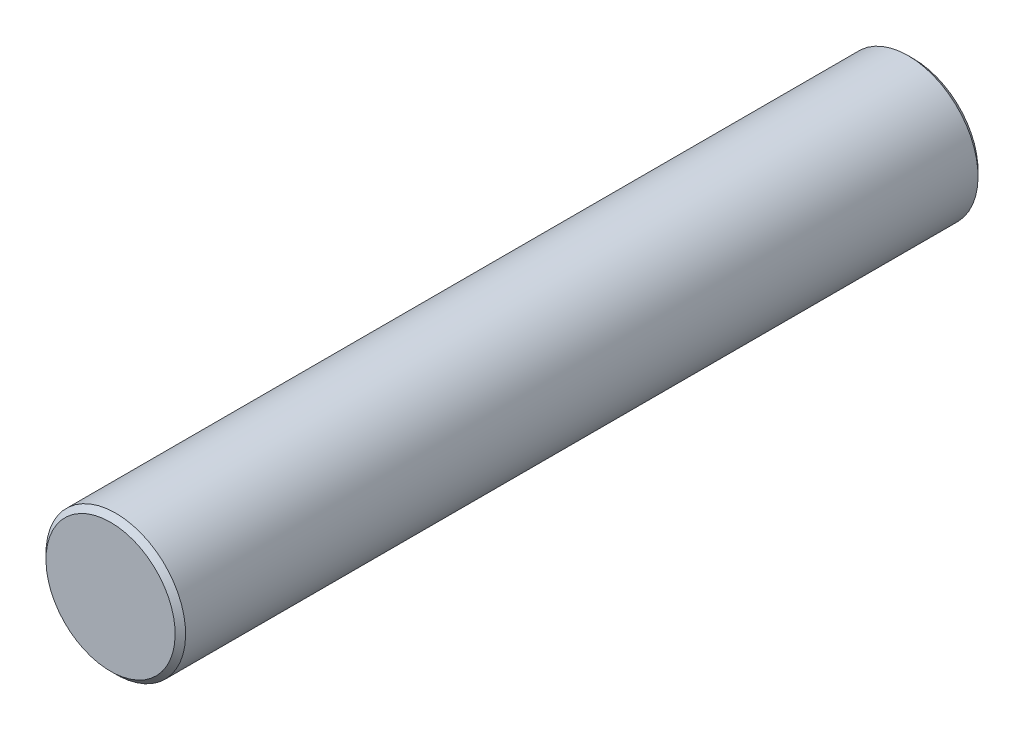
ISO-10303-21;
HEADER;
FILE_DESCRIPTION(('STEP AP214'),'2;1');
FILE_NAME('part.step','',(''),(''),'','','');
FILE_SCHEMA(('AUTOMOTIVE_DESIGN { 1 0 10303 214 1 1 1 1 }'));
ENDSEC;
DATA;
#1=APPLICATION_CONTEXT('core data for automotive mechanical design processes');
#2=APPLICATION_PROTOCOL_DEFINITION('international standard','automotive_design',2000,#1);
#3=PRODUCT_CONTEXT('',#1,'mechanical');
#4=PRODUCT('Part','Part','',(#3));
#5=PRODUCT_RELATED_PRODUCT_CATEGORY('part','',(#4));
#6=PRODUCT_DEFINITION_FORMATION('','',#4);
#7=PRODUCT_DEFINITION_CONTEXT('part definition',#1,'design');
#8=PRODUCT_DEFINITION('design','',#6,#7);
#9=PRODUCT_DEFINITION_SHAPE('','',#8);
#10=(LENGTH_UNIT() NAMED_UNIT(*) SI_UNIT(.MILLI.,.METRE.));
#11=(NAMED_UNIT(*) PLANE_ANGLE_UNIT() SI_UNIT($,.RADIAN.));
#12=(NAMED_UNIT(*) SI_UNIT($,.STERADIAN.) SOLID_ANGLE_UNIT());
#13=UNCERTAINTY_MEASURE_WITH_UNIT(LENGTH_MEASURE(1.E-05),#10,'distance_accuracy_value','');
#14=(GEOMETRIC_REPRESENTATION_CONTEXT(3) GLOBAL_UNCERTAINTY_ASSIGNED_CONTEXT((#13)) GLOBAL_UNIT_ASSIGNED_CONTEXT((#10,
#11,#12)) REPRESENTATION_CONTEXT('',''));
#15=CARTESIAN_POINT('',(0.,0.,0.));
#16=DIRECTION('',(0.,0.,1.));
#17=DIRECTION('',(1.,0.,0.));
#18=AXIS2_PLACEMENT_3D('',#15,#16,#17);
#19=CARTESIAN_POINT('',(0.,9.25,0.));
#20=DIRECTION('',(0.,0.,-1.));
#21=DIRECTION('',(0.,1.,0.));
#22=AXIS2_PLACEMENT_3D('',#19,#20,#21);
#23=PLANE('',#22);
#24=CARTESIAN_POINT('',(0.,0.,0.));
#25=DIRECTION('',(0.,0.,-1.));
#26=DIRECTION('',(0.,1.,0.));
#27=AXIS2_PLACEMENT_3D('',#24,#25,#26);
#28=CIRCLE('',#27,18.5);
#29=CARTESIAN_POINT('',(0.,18.5,0.));
#30=VERTEX_POINT('',#29);
#31=EDGE_CURVE('E9',#30,#30,#28,.T.);
#32=ORIENTED_EDGE('',*,*,#31,.T.);
#33=EDGE_LOOP('',(#32));
#34=FACE_BOUND('',#33,.T.);
#35=CARTESIAN_POINT('',(0.,0.,0.));
#36=DIRECTION('',(0.,0.,1.));
#37=DIRECTION('',(-1.,0.,0.));
#38=AXIS2_PLACEMENT_3D('',#35,#36,#37);
#39=CIRCLE('',#38,6.);
#40=CARTESIAN_POINT('',(-6.,0.,0.));
#41=VERTEX_POINT('',#40);
#42=EDGE_CURVE('E66',#41,#41,#39,.T.);
#43=ORIENTED_EDGE('',*,*,#42,.T.);
#44=EDGE_LOOP('',(#43));
#45=FACE_BOUND('',#44,.T.);
#46=ADVANCED_FACE('F15',(#34,#45),#23,.T.);
#47=CARTESIAN_POINT('',(0.,0.,0.75));
#48=DIRECTION('',(0.,0.,1.));
#49=DIRECTION('',(0.,1.,0.));
#50=AXIS2_PLACEMENT_3D('',#47,#48,#49);
#51=CONICAL_SURFACE('',#50,19.25,0.785398163397448);
#52=CARTESIAN_POINT('',(0.,0.,1.5));
#53=DIRECTION('',(0.,0.,-1.));
#54=DIRECTION('',(0.,1.,0.));
#55=AXIS2_PLACEMENT_3D('',#52,#53,#54);
#56=CIRCLE('',#55,20.);
#57=CARTESIAN_POINT('',(0.,20.,1.5));
#58=VERTEX_POINT('',#57);
#59=EDGE_CURVE('E25',#58,#58,#56,.T.);
#60=ORIENTED_EDGE('',*,*,#59,.T.);
#61=EDGE_LOOP('',(#60));
#62=FACE_BOUND('',#61,.T.);
#63=ORIENTED_EDGE('',*,*,#31,.F.);
#64=EDGE_LOOP('',(#63));
#65=FACE_BOUND('',#64,.T.);
#66=ADVANCED_FACE('F113',(#62,#65),#51,.T.);
#67=CARTESIAN_POINT('',(0.,0.,115.));
#68=DIRECTION('',(0.,0.,1.));
#69=DIRECTION('',(0.,1.,0.));
#70=AXIS2_PLACEMENT_3D('',#67,#68,#69);
#71=CYLINDRICAL_SURFACE('',#70,20.);
#72=CARTESIAN_POINT('',(0.,0.,228.5));
#73=DIRECTION('',(0.,0.,-1.));
#74=DIRECTION('',(0.,1.,0.));
#75=AXIS2_PLACEMENT_3D('',#72,#73,#74);
#76=CIRCLE('',#75,20.);
#77=CARTESIAN_POINT('',(0.,20.,228.5));
#78=VERTEX_POINT('',#77);
#79=EDGE_CURVE('E19',#78,#78,#76,.T.);
#80=ORIENTED_EDGE('',*,*,#79,.T.);
#81=EDGE_LOOP('',(#80));
#82=FACE_BOUND('',#81,.T.);
#83=ORIENTED_EDGE('',*,*,#59,.F.);
#84=EDGE_LOOP('',(#83));
#85=FACE_BOUND('',#84,.T.);
#86=CARTESIAN_POINT('',(0.,0.,6.5));
#87=DIRECTION('',(0.,0.,-1.));
#88=DIRECTION('',(0.,1.,0.));
#89=AXIS2_PLACEMENT_3D('',#86,#87,#88);
#90=CIRCLE('',#89,20.);
#91=CARTESIAN_POINT('',(10.5356537528527,-17.,6.5));
#92=VERTEX_POINT('',#91);
#93=CARTESIAN_POINT('',(-10.5356537528527,-17.,6.5));
#94=VERTEX_POINT('',#93);
#95=EDGE_CURVE('E74',#92,#94,#90,.T.);
#96=ORIENTED_EDGE('',*,*,#95,.T.);
#97=DIRECTION('',(0.,0.,1.));
#98=VECTOR('',#97,1.);
#99=CARTESIAN_POINT('',(-10.5356537528527,-17.,8.25));
#100=LINE('',#99,#98);
#101=CARTESIAN_POINT('',(-10.5356537528527,-17.,10.));
#102=VERTEX_POINT('',#101);
#103=EDGE_CURVE('E82',#94,#102,#100,.T.);
#104=ORIENTED_EDGE('',*,*,#103,.T.);
#105=CARTESIAN_POINT('',(0.,0.,10.));
#106=DIRECTION('',(0.,0.,1.));
#107=DIRECTION('',(0.,1.,0.));
#108=AXIS2_PLACEMENT_3D('',#105,#106,#107);
#109=CIRCLE('',#108,20.);
#110=CARTESIAN_POINT('',(10.5356537528527,-17.,10.));
#111=VERTEX_POINT('',#110);
#112=EDGE_CURVE('E81',#102,#111,#109,.T.);
#113=ORIENTED_EDGE('',*,*,#112,.T.);
#114=DIRECTION('',(0.,0.,-1.));
#115=VECTOR('',#114,1.);
#116=CARTESIAN_POINT('',(10.5356537528527,-17.,8.25));
#117=LINE('',#116,#115);
#118=EDGE_CURVE('E72',#111,#92,#117,.T.);
#119=ORIENTED_EDGE('',*,*,#118,.T.);
#120=EDGE_LOOP('',(#96,#104,#113,#119));
#121=FACE_BOUND('',#120,.T.);
#122=ADVANCED_FACE('F17',(#82,#85,#121),#71,.T.);
#123=CARTESIAN_POINT('',(0.,0.,229.25));
#124=DIRECTION('',(0.,0.,-1.));
#125=DIRECTION('',(0.,1.,0.));
#126=AXIS2_PLACEMENT_3D('',#123,#124,#125);
#127=CONICAL_SURFACE('',#126,19.25,0.785398163397448);
#128=CARTESIAN_POINT('',(0.,0.,230.));
#129=DIRECTION('',(0.,0.,-1.));
#130=DIRECTION('',(0.,1.,0.));
#131=AXIS2_PLACEMENT_3D('',#128,#129,#130);
#132=CIRCLE('',#131,18.5);
#133=CARTESIAN_POINT('',(0.,18.5,230.));
#134=VERTEX_POINT('',#133);
#135=EDGE_CURVE('E60',#134,#134,#132,.T.);
#136=ORIENTED_EDGE('',*,*,#135,.T.);
#137=EDGE_LOOP('',(#136));
#138=FACE_BOUND('',#137,.T.);
#139=ORIENTED_EDGE('',*,*,#79,.F.);
#140=EDGE_LOOP('',(#139));
#141=FACE_BOUND('',#140,.T.);
#142=ADVANCED_FACE('F61',(#138,#141),#127,.T.);
#143=CARTESIAN_POINT('',(0.,9.25,230.));
#144=DIRECTION('',(0.,0.,1.));
#145=DIRECTION('',(0.,-1.,0.));
#146=AXIS2_PLACEMENT_3D('',#143,#144,#145);
#147=PLANE('',#146);
#148=ORIENTED_EDGE('',*,*,#135,.F.);
#149=EDGE_LOOP('',(#148));
#150=FACE_BOUND('',#149,.T.);
#151=ADVANCED_FACE('F105',(#150),#147,.T.);
#152=CARTESIAN_POINT('',(0.,0.,26.4586213285198));
#153=DIRECTION('',(0.,0.,-1.));
#154=DIRECTION('',(-1.,0.,0.));
#155=AXIS2_PLACEMENT_3D('',#152,#153,#154);
#156=CONICAL_SURFACE('',#155,2.52640625,1.0471975511966);
#157=CARTESIAN_POINT('',(0.,0.,25.));
#158=DIRECTION('',(0.,0.,1.));
#159=DIRECTION('',(-1.,0.,0.));
#160=AXIS2_PLACEMENT_3D('',#157,#158,#159);
#161=CIRCLE('',#160,5.0528125);
#162=CARTESIAN_POINT('',(-5.0528125,0.,25.));
#163=VERTEX_POINT('',#162);
#164=EDGE_CURVE('E64',#163,#163,#161,.T.);
#165=ORIENTED_EDGE('',*,*,#164,.F.);
#166=EDGE_LOOP('',(#165));
#167=FACE_BOUND('',#166,.T.);
#168=CARTESIAN_POINT('',(0.,0.,27.9172426570397));
#169=VERTEX_POINT('',#168);
#170=VERTEX_LOOP('',#169);
#171=FACE_BOUND('',#170,.T.);
#172=ADVANCED_FACE('F99',(#167,#171),#156,.F.);
#173=CARTESIAN_POINT('',(0.,0.,12.97359375));
#174=DIRECTION('',(0.,0.,-1.));
#175=DIRECTION('',(-1.,0.,0.));
#176=AXIS2_PLACEMENT_3D('',#173,#174,#175);
#177=CYLINDRICAL_SURFACE('',#176,5.0528125);
#178=CARTESIAN_POINT('',(0.,0.,0.9471875));
#179=DIRECTION('',(0.,0.,1.));
#180=DIRECTION('',(-1.,0.,0.));
#181=AXIS2_PLACEMENT_3D('',#178,#179,#180);
#182=CIRCLE('',#181,5.0528125);
#183=CARTESIAN_POINT('',(-5.0528125,0.,0.9471875));
#184=VERTEX_POINT('',#183);
#185=EDGE_CURVE('E70',#184,#184,#182,.T.);
#186=ORIENTED_EDGE('',*,*,#185,.F.);
#187=EDGE_LOOP('',(#186));
#188=FACE_BOUND('',#187,.T.);
#189=ORIENTED_EDGE('',*,*,#164,.T.);
#190=EDGE_LOOP('',(#189));
#191=FACE_BOUND('',#190,.T.);
#192=ADVANCED_FACE('F93',(#188,#191),#177,.F.);
#193=CARTESIAN_POINT('',(0.,0.,0.47359375));
#194=DIRECTION('',(0.,0.,-1.));
#195=DIRECTION('',(-1.,0.,0.));
#196=AXIS2_PLACEMENT_3D('',#193,#194,#195);
#197=CONICAL_SURFACE('',#196,5.52640625,0.785398163397448);
#198=ORIENTED_EDGE('',*,*,#42,.F.);
#199=EDGE_LOOP('',(#198));
#200=FACE_BOUND('',#199,.T.);
#201=ORIENTED_EDGE('',*,*,#185,.T.);
#202=EDGE_LOOP('',(#201));
#203=FACE_BOUND('',#202,.T.);
#204=ADVANCED_FACE('F89',(#200,#203),#197,.F.);
#205=CARTESIAN_POINT('',(0.,-17.,8.25));
#206=DIRECTION('',(0.,-1.,0.));
#207=DIRECTION('',(0.,0.,-1.));
#208=AXIS2_PLACEMENT_3D('',#205,#206,#207);
#209=PLANE('',#208);
#210=ORIENTED_EDGE('',*,*,#103,.F.);
#211=DIRECTION('',(1.,0.,0.));
#212=VECTOR('',#211,1.);
#213=CARTESIAN_POINT('',(0.,-17.,6.5));
#214=LINE('',#213,#212);
#215=EDGE_CURVE('E77',#94,#92,#214,.T.);
#216=ORIENTED_EDGE('',*,*,#215,.T.);
#217=ORIENTED_EDGE('',*,*,#118,.F.);
#218=DIRECTION('',(-1.,0.,0.));
#219=VECTOR('',#218,1.);
#220=CARTESIAN_POINT('',(0.,-17.,10.));
#221=LINE('',#220,#219);
#222=EDGE_CURVE('E78',#111,#102,#221,.T.);
#223=ORIENTED_EDGE('',*,*,#222,.T.);
#224=EDGE_LOOP('',(#210,#216,#217,#223));
#225=FACE_BOUND('',#224,.T.);
#226=ADVANCED_FACE('F92',(#225),#209,.T.);
#227=CARTESIAN_POINT('',(0.,-19.5,6.5));
#228=DIRECTION('',(0.,0.,1.));
#229=DIRECTION('',(1.,0.,0.));
#230=AXIS2_PLACEMENT_3D('',#227,#228,#229);
#231=PLANE('',#230);
#232=ORIENTED_EDGE('',*,*,#95,.F.);
#233=ORIENTED_EDGE('',*,*,#215,.F.);
#234=EDGE_LOOP('',(#232,#233));
#235=FACE_BOUND('',#234,.T.);
#236=ADVANCED_FACE('F124',(#235),#231,.T.);
#237=CARTESIAN_POINT('',(0.,-19.5,10.));
#238=DIRECTION('',(0.,0.,1.));
#239=DIRECTION('',(1.,0.,0.));
#240=AXIS2_PLACEMENT_3D('',#237,#238,#239);
#241=PLANE('',#240);
#242=ORIENTED_EDGE('',*,*,#112,.F.);
#243=ORIENTED_EDGE('',*,*,#222,.F.);
#244=EDGE_LOOP('',(#242,#243));
#245=FACE_BOUND('',#244,.T.);
#246=ADVANCED_FACE('F122',(#245),#241,.F.);
#247=CLOSED_SHELL('',(#46,#66,#122,#142,#151,#172,#192,#204,#226,#236,#246));
#248=MANIFOLD_SOLID_BREP('B1',#247);
#249=ADVANCED_BREP_SHAPE_REPRESENTATION('',(#18,#248),#14);
#250=SHAPE_DEFINITION_REPRESENTATION(#9,#249);
ENDSEC;
END-ISO-10303-21;
